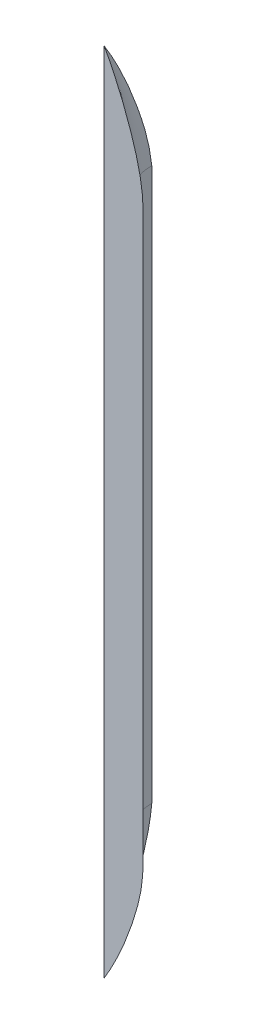
ISO-10303-21;
HEADER;
FILE_DESCRIPTION(('STEP AP214'),'2;1');
FILE_NAME('part.step','',(''),(''),'','','');
FILE_SCHEMA(('AUTOMOTIVE_DESIGN { 1 0 10303 214 1 1 1 1 }'));
ENDSEC;
DATA;
#1=APPLICATION_CONTEXT('core data for automotive mechanical design processes');
#2=APPLICATION_PROTOCOL_DEFINITION('international standard','automotive_design',2000,#1);
#3=PRODUCT_CONTEXT('',#1,'mechanical');
#4=PRODUCT('Part','Part','',(#3));
#5=PRODUCT_RELATED_PRODUCT_CATEGORY('part','',(#4));
#6=PRODUCT_DEFINITION_FORMATION('','',#4);
#7=PRODUCT_DEFINITION_CONTEXT('part definition',#1,'design');
#8=PRODUCT_DEFINITION('design','',#6,#7);
#9=PRODUCT_DEFINITION_SHAPE('','',#8);
#10=(LENGTH_UNIT() NAMED_UNIT(*) SI_UNIT(.MILLI.,.METRE.));
#11=(NAMED_UNIT(*) PLANE_ANGLE_UNIT() SI_UNIT($,.RADIAN.));
#12=(NAMED_UNIT(*) SI_UNIT($,.STERADIAN.) SOLID_ANGLE_UNIT());
#13=UNCERTAINTY_MEASURE_WITH_UNIT(LENGTH_MEASURE(1.E-05),#10,'distance_accuracy_value','');
#14=(GEOMETRIC_REPRESENTATION_CONTEXT(3) GLOBAL_UNCERTAINTY_ASSIGNED_CONTEXT((#13)) GLOBAL_UNIT_ASSIGNED_CONTEXT((#10,
#11,#12)) REPRESENTATION_CONTEXT('',''));
#15=CARTESIAN_POINT('',(0.,0.,0.));
#16=DIRECTION('',(0.,0.,1.));
#17=DIRECTION('',(1.,0.,0.));
#18=AXIS2_PLACEMENT_3D('',#15,#16,#17);
#19=CARTESIAN_POINT('',(-5.0632934730048,495.3,-82.4443347354502));
#20=DIRECTION('',(0.0640045787989284,0.,-0.997949604886325));
#21=DIRECTION('',(-0.997949604886325,0.,-0.0640045787989284));
#22=AXIS2_PLACEMENT_3D('',#19,#20,#21);
#23=PLANE('',#22);
#24=DIRECTION('',(0.,-1.,0.));
#25=VECTOR('',#24,1.);
#26=CARTESIAN_POINT('',(-5.0632934730048,495.3,-82.4443347354502));
#27=LINE('',#26,#25);
#28=CARTESIAN_POINT('',(-5.0632934730048,448.126304510423,-82.4443347354502));
#29=VERTEX_POINT('',#28);
#30=CARTESIAN_POINT('',(-5.0632934730048,47.1736954896169,-82.4443347354502));
#31=VERTEX_POINT('',#30);
#32=EDGE_CURVE('E100',#29,#31,#27,.T.);
#33=ORIENTED_EDGE('',*,*,#32,.T.);
#34=CARTESIAN_POINT('',(15.5577269047475,110.49,-81.1217832586825));
#35=CARTESIAN_POINT('',(15.5575366935233,109.786608337865,-81.1218317490463));
#36=CARTESIAN_POINT('',(15.5550280221709,109.083189292789,-81.1223021604709));
#37=CARTESIAN_POINT('',(15.5431777345897,107.744037800418,-81.1236801610753));
#38=CARTESIAN_POINT('',(15.5345161344242,107.108298758008,-81.1245413785588));
#39=CARTESIAN_POINT('',(15.5104082642399,105.904392980931,-81.1263288035558));
#40=CARTESIAN_POINT('',(15.4957790268235,105.336210924997,-81.1272384300958));
#41=CARTESIAN_POINT('',(15.459493830325,104.267470258499,-81.1292084447515));
#42=CARTESIAN_POINT('',(15.4388762864435,103.766878876906,-81.130238183201));
#43=CARTESIAN_POINT('',(15.4012597654857,103.041619563127,-81.1322135831098));
#44=CARTESIAN_POINT('',(15.3885149868308,102.816732244992,-81.132893572759));
#45=CARTESIAN_POINT('',(15.3612022898933,102.383930340124,-81.1344597593817));
#46=CARTESIAN_POINT('',(15.3468416673897,102.176002738283,-81.1353267590709));
#47=CARTESIAN_POINT('',(15.3107073608198,101.69526548088,-81.1376022954161));
#48=CARTESIAN_POINT('',(15.2880204485959,101.422524999556,-81.1390953939153));
#49=CARTESIAN_POINT('',(15.2389411429204,100.875242351012,-81.1423169858888));
#50=CARTESIAN_POINT('',(15.2125212737476,100.600702690005,-81.1440472216447));
#51=CARTESIAN_POINT('',(15.1270625482394,99.7710618712145,-81.1496430884118));
#52=CARTESIAN_POINT('',(15.0623249569574,99.2165396990564,-81.1538810891806));
#53=CARTESIAN_POINT('',(14.9173825192057,98.1002297950573,-81.1632627509594));
#54=CARTESIAN_POINT('',(14.8369399369539,97.538473275101,-81.1684202102351));
#55=CARTESIAN_POINT('',(14.6603607459544,96.4076607703985,-81.1796685657268));
#56=CARTESIAN_POINT('',(14.5639806328903,95.8386430002989,-81.1857738371608));
#57=CARTESIAN_POINT('',(14.355508967988,94.6932696782545,-81.1989641176007));
#58=CARTESIAN_POINT('',(14.2431731278992,94.1169588147895,-81.2060643311504));
#59=CARTESIAN_POINT('',(13.9393630117844,92.6558602000597,-81.2256238920259));
#60=CARTESIAN_POINT('',(13.7379910453242,91.7731411294594,-81.2389023704842));
#61=CARTESIAN_POINT('',(13.2840344775509,89.9099546166205,-81.2688667712425));
#62=CARTESIAN_POINT('',(13.0282091230779,88.9302920804297,-81.2857699988611));
#63=CARTESIAN_POINT('',(12.4624571625742,86.8732748422379,-81.3226919713213));
#64=CARTESIAN_POINT('',(12.1496708589326,85.7967133794336,-81.3428504154451));
#65=CARTESIAN_POINT('',(11.4657847371205,83.5466552756897,-81.386410307294));
#66=CARTESIAN_POINT('',(11.0919738875445,82.3739864787359,-81.4099360408043));
#67=CARTESIAN_POINT('',(10.4966927279046,80.5828660558859,-81.4472867205596));
#68=CARTESIAN_POINT('',(10.2854693539199,79.9609726575605,-81.4605195909538));
#69=CARTESIAN_POINT('',(9.84556336889945,78.693892610274,-81.4883501613545));
#70=CARTESIAN_POINT('',(9.61652014958023,78.0488317558467,-81.5029819023576));
#71=CARTESIAN_POINT('',(9.19028844175516,76.8700360711208,-81.530038711265));
#72=CARTESIAN_POINT('',(8.99424666011761,76.3358836900514,-81.5424195038367));
#73=CARTESIAN_POINT('',(8.59882910881611,75.2713117913826,-81.5668338746006));
#74=CARTESIAN_POINT('',(8.39947039926122,74.740885960814,-81.5788686729805));
#75=CARTESIAN_POINT('',(7.79690089351121,73.1590836033903,-81.6148520894418));
#76=CARTESIAN_POINT('',(7.38673054130219,72.1103457202904,-81.6388336360614));
#77=CARTESIAN_POINT('',(6.54949127412712,70.0304709509396,-81.6881876652177));
#78=CARTESIAN_POINT('',(6.12260488205441,68.9992604705393,-81.7135458961838));
#79=CARTESIAN_POINT('',(5.46689962938753,67.4632707725281,-81.7541079586448));
#80=CARTESIAN_POINT('',(5.24656112429327,66.9548279263916,-81.7679968086626));
#81=CARTESIAN_POINT('',(4.80113811555572,65.9429049599631,-81.7968306849424));
#82=CARTESIAN_POINT('',(4.57608077710105,65.4394127465857,-81.8117704418132));
#83=CARTESIAN_POINT('',(4.12104045000123,64.4375886843729,-81.8430009154255));
#84=CARTESIAN_POINT('',(3.89108598268971,63.939243681381,-81.8592848681738));
#85=CARTESIAN_POINT('',(3.54202040842532,63.1947993683425,-81.8849030657872));
#86=CARTESIAN_POINT('',(3.4251910087108,62.9476072820322,-81.893624351331));
#87=CARTESIAN_POINT('',(3.19015134828709,62.4546323668223,-81.9116062668161));
#88=CARTESIAN_POINT('',(3.07194509718709,62.2088475769732,-81.9208655453332));
#89=CARTESIAN_POINT('',(2.84460824645599,61.7389759752497,-81.9387128065561));
#90=CARTESIAN_POINT('',(2.73557238881176,61.5148427800191,-81.9472899576738));
#91=CARTESIAN_POINT('',(2.51550951584694,61.0638215499608,-81.9642554084271));
#92=CARTESIAN_POINT('',(2.40447539320521,60.836936830662,-81.9726396392685));
#93=CARTESIAN_POINT('',(2.06589884687473,60.1478350553994,-81.9978408406551));
#94=CARTESIAN_POINT('',(1.83722883753943,59.6861603638199,-82.0143636836794));
#95=CARTESIAN_POINT('',(1.37068282969449,58.75255996733,-82.0471162350432));
#96=CARTESIAN_POINT('',(1.13272137403132,58.2806762840697,-82.0633274508181));
#97=CARTESIAN_POINT('',(0.646931514773846,57.327113002047,-82.0956010434976));
#98=CARTESIAN_POINT('',(0.399005084827022,56.8454828972528,-82.1116496046755));
#99=CARTESIAN_POINT('',(-0.369626198345435,55.3692328513354,-82.1603744495625));
#100=CARTESIAN_POINT('',(-0.897713209060645,54.3784168512676,-82.1924244355208));
#101=CARTESIAN_POINT('',(-2.00128167439423,52.3635875478879,-82.258328274264));
#102=CARTESIAN_POINT('',(-2.577825604154,51.3401544501378,-82.2921970750983));
#103=CARTESIAN_POINT('',(-3.78428318262059,49.2651146064168,-82.364387936577));
#104=CARTESIAN_POINT('',(-4.41542797012666,48.214229115757,-82.4028398770589));
#105=CARTESIAN_POINT('',(-5.0632934730048,47.1736954896169,-82.4443347354502));
#106=B_SPLINE_CURVE_WITH_KNOTS('',3,(#34,#35,#36,#37,#38,#39,#40,#41,#42,#43,#44,#45,#46,#47,
#48,#49,#50,#51,#52,#53,#54,#55,#56,#57,#58,#59,#60,#61,#62,#63,#64,#65,#66,#67,#68,#69,#70,#71,
#72,#73,#74,#75,#76,#77,#78,#79,#80,#81,#82,#83,#84,#85,#86,#87,#88,#89,#90,#91,#92,#93,#94,#95,
#96,#97,#98,#99,#100,#101,#102,#103,#104,#105),.UNSPECIFIED.,.F.,.F.,(4,2,2,2,2,2,2,2,2,2,2,2,2,
2,2,2,2,2,2,2,2,2,2,2,2,2,2,2,2,2,2,2,2,2,2,4),(0.,2.11021294848877,4.01757617488843,
5.72264034907928,7.2256022195464,7.9013358028512,8.52659385749051,9.34762277126733,
10.1750442567903,11.8497402288947,13.5520876399653,15.2833688844945,17.0447869286252,
19.7606917128943,22.7982538785374,26.1616511554232,29.8543129571136,31.8250205335883,
33.8789780952208,35.5863380402268,37.2866649087354,40.6655135515084,44.014341264787,
45.6772303172088,47.3323058113954,48.9795087714192,49.8001504287814,50.6188129985741,
51.3669983162158,52.1252058701779,53.671594938095,55.2577882064351,56.8835746718496,
60.2529780543273,63.7779949493876,67.4569401812508),.UNSPECIFIED.);
#107=CARTESIAN_POINT('',(15.5538463388611,110.49,-81.1222774657432));
#108=VERTEX_POINT('',#107);
#109=EDGE_CURVE('E12',#31,#108,#106,.F.);
#110=ORIENTED_EDGE('',*,*,#109,.T.);
#111=DIRECTION('',(0.,-1.,0.));
#112=VECTOR('',#111,1.);
#113=CARTESIAN_POINT('',(15.553799764757,495.3,-81.1220351300593));
#114=LINE('',#113,#112);
#115=CARTESIAN_POINT('',(15.5557633347523,384.81,-81.1219091943709));
#116=VERTEX_POINT('',#115);
#117=EDGE_CURVE('E103',#116,#108,#114,.T.);
#118=ORIENTED_EDGE('',*,*,#117,.F.);
#119=CARTESIAN_POINT('',(-5.06329347300487,448.126304510423,-82.4443347354503));
#120=CARTESIAN_POINT('',(-4.54310536157747,447.290836051475,-82.4108329491727));
#121=CARTESIAN_POINT('',(-4.03234753509438,446.449497365503,-82.3776543123072));
#122=CARTESIAN_POINT('',(-2.99342851650294,444.695093743187,-82.3100855320759));
#123=CARTESIAN_POINT('',(-2.46664382864215,443.781210016785,-82.2757790009647));
#124=CARTESIAN_POINT('',(-1.39949043381827,441.880225064239,-82.2068217596031));
#125=CARTESIAN_POINT('',(-0.8605641195627,440.89231015954,-82.1723010798713));
#126=CARTESIAN_POINT('',(0.227478989577566,438.842308407112,-82.1030328292366));
#127=CARTESIAN_POINT('',(0.775132330113729,437.779440700385,-82.0684055792594));
#128=CARTESIAN_POINT('',(1.59020391293753,436.152591437293,-82.0168940334973));
#129=CARTESIAN_POINT('',(1.8664318039864,435.593017566567,-81.9994411800814));
#130=CARTESIAN_POINT('',(2.42035444091683,434.455218972556,-81.9642078845472));
#131=CARTESIAN_POINT('',(2.69787526181041,433.876909316685,-81.9464318803808));
#132=CARTESIAN_POINT('',(3.20385404486276,432.806217800267,-81.9142238789823));
#133=CARTESIAN_POINT('',(3.43329238379445,432.314302093572,-81.899698107054));
#134=CARTESIAN_POINT('',(3.87532104592261,431.353069427417,-81.8721558443334));
#135=CARTESIAN_POINT('',(4.08817495129466,430.883874752685,-81.8591001668305));
#136=CARTESIAN_POINT('',(4.68617730705948,429.548921878612,-81.8226368946435));
#137=CARTESIAN_POINT('',(5.06602472559113,428.680773214917,-81.7997356959407));
#138=CARTESIAN_POINT('',(6.05421966718013,426.372478044547,-81.7398469334692));
#139=CARTESIAN_POINT('',(6.65065860250828,424.927216913056,-81.7033759216996));
#140=CARTESIAN_POINT('',(7.64792886805931,422.434752328516,-81.6394917962511));
#141=CARTESIAN_POINT('',(8.05637697302166,421.390565175931,-81.6124339374562));
#142=CARTESIAN_POINT('',(8.59921901271706,419.974758204318,-81.5748420683154));
#143=CARTESIAN_POINT('',(8.73979877063413,419.605485906506,-81.5649544831246));
#144=CARTESIAN_POINT('',(8.98045818591475,418.969336502394,-81.5477098179637));
#145=CARTESIAN_POINT('',(9.08090818955125,418.70259826831,-81.5404153089989));
#146=CARTESIAN_POINT('',(9.24213950199601,418.271689839071,-81.5286692505397));
#147=CARTESIAN_POINT('',(9.30327375002304,418.107650923481,-81.5242066213181));
#148=CARTESIAN_POINT('',(9.3872493358516,417.882558744905,-81.5179114642086));
#149=CARTESIAN_POINT('',(9.41004236475164,417.821487034178,-81.5161861314594));
#150=CARTESIAN_POINT('',(9.46250405229587,417.678205157731,-81.5125535202861));
#151=CARTESIAN_POINT('',(9.49187003053749,417.595880862759,-81.5107844629964));
#152=CARTESIAN_POINT('',(9.55063446999732,417.431713104916,-81.5071099904551));
#153=CARTESIAN_POINT('',(9.58003203847406,417.349869291985,-81.5052052994124));
#154=CARTESIAN_POINT('',(9.66748570623671,417.105459818169,-81.4995837012212));
#155=CARTESIAN_POINT('',(9.72524921671702,416.942787259255,-81.4959296728174));
#156=CARTESIAN_POINT('',(9.83970246635365,416.618911006539,-81.4886780233115));
#157=CARTESIAN_POINT('',(9.89639715876105,416.457709059347,-81.4850802051276));
#158=CARTESIAN_POINT('',(10.0086496915035,416.136750815702,-81.4779753281481));
#159=CARTESIAN_POINT('',(10.0642132294125,415.976996525957,-81.4744677181043));
#160=CARTESIAN_POINT('',(10.2283964287872,415.502387204995,-81.4641143371477));
#161=CARTESIAN_POINT('',(10.3362476886985,415.187264636529,-81.4573278907551));
#162=CARTESIAN_POINT('',(10.5476121057884,414.562885679937,-81.4440438726744));
#163=CARTESIAN_POINT('',(10.6511688245411,414.253644085804,-81.4375432280802));
#164=CARTESIAN_POINT('',(10.9522281190891,413.344644997367,-81.4186414688683));
#165=CARTESIAN_POINT('',(11.1469179411347,412.743948967681,-81.406413986046));
#166=CARTESIAN_POINT('',(11.5199468032046,411.566370503538,-81.3828939585697));
#167=CARTESIAN_POINT('',(11.6986285196,410.989596904191,-81.3715839188197));
#168=CARTESIAN_POINT('',(12.0402749012769,409.860039246955,-81.3498287192234));
#169=CARTESIAN_POINT('',(12.2035847304427,409.307360090661,-81.3393676356166));
#170=CARTESIAN_POINT('',(12.514983402368,408.226112576805,-81.31929244037));
#171=CARTESIAN_POINT('',(12.6634267689103,407.697646443691,-81.3096617029959));
#172=CARTESIAN_POINT('',(13.0759742667982,406.187777956141,-81.2827284018913));
#173=CARTESIAN_POINT('',(13.3309419259207,405.203841247798,-81.2658755831084));
#174=CARTESIAN_POINT('',(13.7827037452345,403.332347019899,-81.2360413036023));
#175=CARTESIAN_POINT('',(13.9827984306741,402.445600748034,-81.2228389131066));
#176=CARTESIAN_POINT('',(14.2814310180771,400.989879421581,-81.2036107238651));
#177=CARTESIAN_POINT('',(14.390379963242,400.423051448544,-81.1967243337352));
#178=CARTESIAN_POINT('',(14.5926131733855,399.295922689228,-81.1839276015934));
#179=CARTESIAN_POINT('',(14.6861195137932,398.735661940543,-81.1780034472109));
#180=CARTESIAN_POINT('',(14.8574729110574,397.621641313427,-81.1670872304891));
#181=CARTESIAN_POINT('',(14.935540517862,397.067915526536,-81.1620821266432));
#182=CARTESIAN_POINT('',(15.0762444767443,395.966946173725,-81.152975796507));
#183=CARTESIAN_POINT('',(15.1390951657154,395.419730298778,-81.1488621132523));
#184=CARTESIAN_POINT('',(15.222069850707,394.600802947482,-81.1434300907328));
#185=CARTESIAN_POINT('',(15.2477326377544,394.329644866745,-81.1417498297351));
#186=CARTESIAN_POINT('',(15.2954161719238,393.788945026402,-81.1386204520046));
#187=CARTESIAN_POINT('',(15.3174615010941,393.519405471745,-81.1371697777601));
#188=CARTESIAN_POINT('',(15.3525904675982,393.044068051393,-81.134957567614));
#189=CARTESIAN_POINT('',(15.366558992799,392.838336084352,-81.1341141884493));
#190=CARTESIAN_POINT('',(15.3931269042465,392.410046466421,-81.132590557464));
#191=CARTESIAN_POINT('',(15.4055236183647,392.187476307884,-81.1319290626336));
#192=CARTESIAN_POINT('',(15.4421188216672,391.46952241171,-81.1300070669722));
#193=CARTESIAN_POINT('',(15.4621721950059,390.973928624369,-81.1290054103763));
#194=CARTESIAN_POINT('',(15.4974686562344,389.915660957445,-81.1270890841452));
#195=CARTESIAN_POINT('',(15.5116980790659,389.352955660283,-81.1262043711283));
#196=CARTESIAN_POINT('',(15.5351495973464,388.16048117063,-81.1244658667778));
#197=CARTESIAN_POINT('',(15.5435746373777,387.530697300869,-81.1236282743575));
#198=CARTESIAN_POINT('',(15.5551018575363,386.203937753333,-81.1222879480564));
#199=CARTESIAN_POINT('',(15.5575409095161,385.506955759654,-81.1218304261684));
#200=CARTESIAN_POINT('',(15.5577269047476,384.81,-81.1217832586825));
#201=B_SPLINE_CURVE_WITH_KNOTS('',3,(#119,#120,#121,#122,#123,#124,#125,#126,#127,#128,#129,
#130,#131,#132,#133,#134,#135,#136,#137,#138,#139,#140,#141,#142,#143,#144,#145,#146,#147,#148,
#149,#150,#151,#152,#153,#154,#155,#156,#157,#158,#159,#160,#161,#162,#163,#164,#165,#166,#167,
#168,#169,#170,#171,#172,#173,#174,#175,#176,#177,#178,#179,#180,#181,#182,#183,#184,#185,#186,
#187,#188,#189,#190,#191,#192,#193,#194,#195,#196,#197,#198,#199,#200),.UNSPECIFIED.,.F.,.F.,(4,
2,2,2,2,2,2,2,2,2,2,2,2,2,2,2,2,2,2,2,2,2,2,2,2,2,2,2,2,2,2,2,2,2,2,2,2,2,2,2,4),(0.,
2.95416187233922,6.12006178436045,9.49739728527208,13.0855312214746,14.9583498434215,
16.8833974974611,18.5123255677352,20.0584539227639,22.9019831580546,27.5932501997105,
30.9578153006119,32.1435627537203,32.9989149699725,33.5242700414307,33.7198948585671,
33.9821571306371,34.2431111686994,34.7610958869914,35.2738524051772,35.7813841271353,
36.780786455779,37.7593357342152,39.6540073726629,41.4657271800879,43.1948639354291,
44.8418359492832,47.89111355343,50.617932201641,52.3494884903031,54.0534348848416,
55.7309305845744,57.3832083087989,58.2003152140259,59.0116163656147,59.6302229661359,
60.2989578827346,61.7868740282755,63.4754847394008,65.3649758676464,67.4558795399028),.UNSPECIFIED.);
#202=EDGE_CURVE('E98',#116,#29,#201,.F.);
#203=ORIENTED_EDGE('',*,*,#202,.T.);
#204=EDGE_LOOP('',(#33,#110,#118,#203));
#205=FACE_BOUND('',#204,.T.);
#206=ADVANCED_FACE('F52',(#205),#23,.F.);
#207=CARTESIAN_POINT('',(20.3367065269952,495.3,-106.067652037719));
#208=DIRECTION('',(0.,-1.,0.));
#209=DIRECTION('',(0.,0.,-1.));
#210=AXIS2_PLACEMENT_3D('',#207,#208,#209);
#211=CYLINDRICAL_SURFACE('',#210,25.4);
#212=ORIENTED_EDGE('',*,*,#117,.T.);
#213=CARTESIAN_POINT('',(-5.00273344640759,110.49,-107.820587243116));
#214=CARTESIAN_POINT('',(-5.22469859656491,110.49,-104.611984562717));
#215=CARTESIAN_POINT('',(-4.4349317286756,110.49,-98.1107481066585));
#216=CARTESIAN_POINT('',(0.281451387874984,110.49,-89.4923527921373));
#217=CARTESIAN_POINT('',(7.85756033175236,110.49,-83.2374682391791));
#218=CARTESIAN_POINT('',(14.0937797318742,110.49,-81.237624556466));
#219=CARTESIAN_POINT('',(17.2867802001309,110.49,-80.8514281054828));
#220=B_SPLINE_CURVE_WITH_KNOTS('',3,(#213,#214,#215,#216,#217,#218,#219),.UNSPECIFIED.,.F.,.F.,
(4,1,1,1,4),(4.64332088265171,5.02319542018311,5.40306995771452,5.78294449524592,
6.16281903277733),.UNSPECIFIED.);
#221=CARTESIAN_POINT('',(-5.06329347300481,110.49,-106.067652037719));
#222=VERTEX_POINT('',#221);
#223=EDGE_CURVE('E110',#108,#222,#220,.F.);
#224=ORIENTED_EDGE('',*,*,#223,.T.);
#225=DIRECTION('',(0.,-1.,0.));
#226=VECTOR('',#225,1.);
#227=CARTESIAN_POINT('',(-5.06329347300481,495.3,-106.067652037719));
#228=LINE('',#227,#226);
#229=CARTESIAN_POINT('',(-5.06304670242382,384.81,-106.067652146018));
#230=VERTEX_POINT('',#229);
#231=EDGE_CURVE('E119',#230,#222,#228,.T.);
#232=ORIENTED_EDGE('',*,*,#231,.F.);
#233=CARTESIAN_POINT('',(17.2867802001309,384.81,-80.8514281054828));
#234=CARTESIAN_POINT('',(14.0937797318742,384.81,-81.237624556466));
#235=CARTESIAN_POINT('',(7.85756033175236,384.81,-83.2374682391791));
#236=CARTESIAN_POINT('',(0.281451387874984,384.81,-89.4923527921373));
#237=CARTESIAN_POINT('',(-4.4349317286756,384.81,-98.1107481066586));
#238=CARTESIAN_POINT('',(-5.22469859656491,384.81,-104.611984562717));
#239=CARTESIAN_POINT('',(-5.00273344640759,384.81,-107.820587243116));
#240=B_SPLINE_CURVE_WITH_KNOTS('',3,(#233,#234,#235,#236,#237,#238,#239),.UNSPECIFIED.,.F.,.F.,
(4,1,1,1,4),(4.6433208826517,5.02319542018311,5.40306995771452,5.78294449524592,
6.16281903277733),.UNSPECIFIED.);
#241=EDGE_CURVE('E111',#230,#116,#240,.F.);
#242=ORIENTED_EDGE('',*,*,#241,.T.);
#243=EDGE_LOOP('',(#212,#224,#232,#242));
#244=FACE_BOUND('',#243,.T.);
#245=ADVANCED_FACE('F213',(#244),#211,.F.);
#246=CARTESIAN_POINT('',(-5.0632934730048,495.3,-82.4443347354502));
#247=DIRECTION('',(1.,0.,0.));
#248=DIRECTION('',(0.,0.,-1.));
#249=AXIS2_PLACEMENT_3D('',#246,#247,#248);
#250=PLANE('',#249);
#251=ORIENTED_EDGE('',*,*,#231,.T.);
#252=CARTESIAN_POINT('',(-5.0632934730048,81.661043667116,-98.850949476124));
#253=CARTESIAN_POINT('',(-5.06328481235157,82.3590345839259,-99.1032785890547));
#254=CARTESIAN_POINT('',(-5.06324965725077,83.0583522619946,-99.3519234050984));
#255=CARTESIAN_POINT('',(-5.06318741172048,84.4265520092989,-99.8302081109327));
#256=CARTESIAN_POINT('',(-5.06316001914847,85.0953140943441,-100.060191270775));
#257=CARTESIAN_POINT('',(-5.06316385310967,87.0061431657457,-100.706415238622));
#258=CARTESIAN_POINT('',(-5.06326493975883,88.2510353134657,-101.114338848398));
#259=CARTESIAN_POINT('',(-5.06350979025156,90.6174512920908,-101.862399008373));
#260=CARTESIAN_POINT('',(-5.06364793158637,91.7381455147763,-102.205148243285));
#261=CARTESIAN_POINT('',(-5.06361599024677,93.3757873014082,-102.684938071475));
#262=CARTESIAN_POINT('',(-5.06357266459689,93.8896589042439,-102.832490250778));
#263=CARTESIAN_POINT('',(-5.06340414326251,94.8865128992017,-103.112123086913));
#264=CARTESIAN_POINT('',(-5.06328431712565,95.3693862304786,-103.244591363688));
#265=CARTESIAN_POINT('',(-5.06281531831477,96.458048413108,-103.534452457923));
#266=CARTESIAN_POINT('',(-5.06241629774852,97.0643862874075,-103.689797047802));
#267=CARTESIAN_POINT('',(-5.06153584863362,98.2780050442409,-103.98774193691));
#268=CARTESIAN_POINT('',(-5.0610547026811,98.8852758420464,-104.130383468214));
#269=CARTESIAN_POINT('',(-5.05983475199395,100.70606986791,-104.539236293396));
#270=CARTESIAN_POINT('',(-5.05931356838022,101.923625263527,-104.787719818228));
#271=CARTESIAN_POINT('',(-5.05949747951277,104.362908582053,-105.235979939832));
#272=CARTESIAN_POINT('',(-5.06019797618004,105.584603661363,-105.435935956329));
#273=CARTESIAN_POINT('',(-5.06170049140824,108.033364423124,-105.787784827677));
#274=CARTESIAN_POINT('',(-5.06250238432221,109.260421674521,-105.939736366505));
#275=CARTESIAN_POINT('',(-5.06279993193789,110.49,-106.067652470908));
#276=B_SPLINE_CURVE_WITH_KNOTS('',3,(#252,#253,#254,#255,#256,#257,#258,#259,#260,#261,#262,
#263,#264,#265,#266,#267,#268,#269,#270,#271,#272,#273,#274,#275),.UNSPECIFIED.,.F.,.F.,(4,2,2,
2,2,2,2,2,2,2,2,4),(0.,2.2265804516336,4.34815542483877,8.27796223360794,11.793484820674,
13.3973608335437,14.8994623017324,16.7770926078471,18.6483875866108,22.375309491811,
26.0882345109761,29.7966028721281),.UNSPECIFIED.);
#277=CARTESIAN_POINT('',(-5.06329347300481,81.661043667116,-98.850949476124));
#278=VERTEX_POINT('',#277);
#279=EDGE_CURVE('E67',#222,#278,#276,.F.);
#280=ORIENTED_EDGE('',*,*,#279,.T.);
#281=CARTESIAN_POINT('',(-5.06329347300479,47.1736954896169,-82.4443347354502));
#282=CARTESIAN_POINT('',(-5.06331840473781,47.7577799043694,-82.8116530849268));
#283=CARTESIAN_POINT('',(-5.06360504181937,48.3446473419906,-83.1745154928133));
#284=CARTESIAN_POINT('',(-5.06439137439873,49.5500519020011,-83.9074334496417));
#285=CARTESIAN_POINT('',(-5.06490000868985,50.1688333953745,-84.2770871406655));
#286=CARTESIAN_POINT('',(-5.06624137428371,52.1130852148333,-85.41848489263));
#287=CARTESIAN_POINT('',(-5.06679258998858,53.448440768133,-86.173487986878));
#288=CARTESIAN_POINT('',(-5.06671978872928,55.5084492265142,-87.2972982781767));
#289=CARTESIAN_POINT('',(-5.06652638159156,56.2251385804485,-87.6808304598219));
#290=CARTESIAN_POINT('',(-5.06593481172481,57.6912850980401,-88.4510545678187));
#291=CARTESIAN_POINT('',(-5.06552924533097,58.4409635068258,-88.8373260045675));
#292=CARTESIAN_POINT('',(-5.06468453385262,59.9730411011339,-89.6122939330384));
#293=CARTESIAN_POINT('',(-5.06424470587988,60.7556482411944,-90.000579020538));
#294=CARTESIAN_POINT('',(-5.06370799298791,61.9438666400471,-90.5794042978021));
#295=CARTESIAN_POINT('',(-5.06354841422304,62.3474383207218,-90.7741446927195));
#296=CARTESIAN_POINT('',(-5.06337231804415,63.1626718637164,-91.1640658265244));
#297=CARTESIAN_POINT('',(-5.06335823559209,63.5743562315403,-91.3591995535411));
#298=CARTESIAN_POINT('',(-5.06323659449971,64.3490058531598,-91.7227329072105));
#299=CARTESIAN_POINT('',(-5.06314062418898,64.7118008428181,-91.8914951758934));
#300=CARTESIAN_POINT('',(-5.06269514116411,65.4385124913961,-92.2262580539967));
#301=CARTESIAN_POINT('',(-5.06234571469447,65.8024287268528,-92.3922595831748));
#302=CARTESIAN_POINT('',(-5.06111057186478,66.8954504617134,-92.8862955987582));
#303=CARTESIAN_POINT('',(-5.06003779872175,67.6262609301195,-93.2105639693053));
#304=CARTESIAN_POINT('',(-5.05781510707704,69.0912490903065,-93.8494997454453));
#305=CARTESIAN_POINT('',(-5.05666526135751,69.8254230119731,-94.1641758118821));
#306=CARTESIAN_POINT('',(-5.05465242590855,71.296504462486,-94.7847487411148));
#307=CARTESIAN_POINT('',(-5.05378911757986,72.0334080277824,-95.0906550067471));
#308=CARTESIAN_POINT('',(-5.0520989973264,74.2457056132376,-95.9957767422154));
#309=CARTESIAN_POINT('',(-5.05216472017408,75.7257120692602,-96.583705896522));
#310=CARTESIAN_POINT('',(-5.05531765975024,78.689861385565,-97.7341432343376));
#311=CARTESIAN_POINT('',(-5.05839471049539,80.1739735781392,-98.2967302873297));
#312=CARTESIAN_POINT('',(-5.0632934730048,81.661043667116,-98.850949476124));
#313=B_SPLINE_CURVE_WITH_KNOTS('',3,(#281,#282,#283,#284,#285,#286,#287,#288,#289,#290,#291,
#292,#293,#294,#295,#296,#297,#298,#299,#300,#301,#302,#303,#304,#305,#306,#307,#308,#309,#310,
#311,#312),.UNSPECIFIED.,.F.,.F.,(4,2,2,2,2,2,2,2,2,2,2,2,2,2,2,4),(0.,2.06990017864016,
4.23219027625693,8.8333305955536,11.2718367823427,13.8017524591609,16.422555379986,
17.766847581487,19.1336015336528,20.3339692905105,21.5339287851305,23.9324168027834,
26.3286709193867,28.722251658871,33.4995235211212,38.2607231640439),.UNSPECIFIED.);
#314=EDGE_CURVE('E78',#278,#31,#313,.F.);
#315=ORIENTED_EDGE('',*,*,#314,.T.);
#316=ORIENTED_EDGE('',*,*,#32,.F.);
#317=CARTESIAN_POINT('',(-5.0632934730048,413.664662679792,-98.8416536651432));
#318=CARTESIAN_POINT('',(-5.06302041303787,415.183678067427,-98.2921604151542));
#319=CARTESIAN_POINT('',(-5.06468238645625,416.698412555973,-97.7302188072792));
#320=CARTESIAN_POINT('',(-5.06932385676634,419.702327942396,-96.5796455365657));
#321=CARTESIAN_POINT('',(-5.07229157223176,421.19161635993,-95.9912938533326));
#322=CARTESIAN_POINT('',(-5.0758715742867,423.408626975844,-95.0824503932688));
#323=CARTESIAN_POINT('',(-5.07691743581947,424.142208451092,-94.7762615448032));
#324=CARTESIAN_POINT('',(-5.07816278160677,425.601409741811,-94.1552663087752));
#325=CARTESIAN_POINT('',(-5.07836645264705,426.327051011478,-93.8405103989683));
#326=CARTESIAN_POINT('',(-5.07730354690726,427.769807737956,-93.201735196978));
#327=CARTESIAN_POINT('',(-5.07604449764127,428.486947828537,-92.8777716285458));
#328=CARTESIAN_POINT('',(-5.07263567176868,429.557332820924,-92.383985675602));
#329=CARTESIAN_POINT('',(-5.07125023319021,429.912546230056,-92.2184171828357));
#330=CARTESIAN_POINT('',(-5.06769602865695,430.620541087165,-91.8845647970752));
#331=CARTESIAN_POINT('',(-5.06552934720985,430.973326484631,-91.7162892578748));
#332=CARTESIAN_POINT('',(-5.0611919162934,431.656693819706,-91.3877550790004));
#333=CARTESIAN_POINT('',(-5.05902923046274,431.987336449599,-91.227622116998));
#334=CARTESIAN_POINT('',(-5.05524813517817,432.651929409201,-90.9044692908783));
#335=CARTESIAN_POINT('',(-5.05363628638813,432.985873937846,-90.7414374258123));
#336=CARTESIAN_POINT('',(-5.04933013284749,433.997974330685,-90.2446218626878));
#337=CARTESIAN_POINT('',(-5.04723975522673,434.675026111455,-89.9085775661076));
#338=CARTESIAN_POINT('',(-5.04454158645244,436.040596095786,-89.2221889173107));
#339=CARTESIAN_POINT('',(-5.04396749264844,436.7290380668,-88.8716926311497));
#340=CARTESIAN_POINT('',(-5.04404225929115,438.11629475384,-88.1549067020547));
#341=CARTESIAN_POINT('',(-5.04471743740465,438.815017944238,-87.7884396715734));
#342=CARTESIAN_POINT('',(-5.04695913228144,440.22166824633,-87.0382206936211));
#343=CARTESIAN_POINT('',(-5.04854372135391,440.929488510953,-86.6542681977722));
#344=CARTESIAN_POINT('',(-5.05212467844586,442.353046488523,-85.8675117664937));
#345=CARTESIAN_POINT('',(-5.05412862153854,443.068660978933,-85.4644846528457));
#346=CARTESIAN_POINT('',(-5.0579344563098,444.506422017847,-84.6379561896267));
#347=CARTESIAN_POINT('',(-5.05973170057705,445.228427972384,-84.2142097867662));
#348=CARTESIAN_POINT('',(-5.06241294510746,446.677462623761,-83.3445471225705));
#349=CARTESIAN_POINT('',(-5.06327916446728,447.404331087617,-82.8983639852461));
#350=CARTESIAN_POINT('',(-5.06329347300482,448.126304510423,-82.4443347354502));
#351=B_SPLINE_CURVE_WITH_KNOTS('',3,(#317,#318,#319,#320,#321,#322,#323,#324,#325,#326,#327,
#328,#329,#330,#331,#332,#333,#334,#335,#336,#337,#338,#339,#340,#341,#342,#343,#344,#345,#346,
#347,#348,#349,#350),.UNSPECIFIED.,.F.,.F.,(4,2,2,2,2,2,2,2,2,2,2,2,2,2,2,2,4),(0.,
4.8463253898546,9.64979255774889,12.0344767885753,14.4072916684275,16.7679493572249,
17.9436582778041,19.1162531148754,20.2184057064899,21.3332617541384,23.6008139624222,
25.9183512559305,28.2852674781661,30.7009346411859,33.1647302895117,35.6760892765279,
38.2346021460237),.UNSPECIFIED.);
#352=CARTESIAN_POINT('',(-5.06329347300481,413.664662679792,-98.8416536651432));
#353=VERTEX_POINT('',#352);
#354=EDGE_CURVE('E115',#29,#353,#351,.F.);
#355=ORIENTED_EDGE('',*,*,#354,.T.);
#356=CARTESIAN_POINT('',(-5.06279993193789,384.81,-106.067652470908));
#357=CARTESIAN_POINT('',(-5.06250148469545,386.040761840785,-105.939549501426));
#358=CARTESIAN_POINT('',(-5.06169744830844,387.268998702136,-105.787383406789));
#359=CARTESIAN_POINT('',(-5.06019124691254,389.720065094822,-105.435050592976));
#360=CARTESIAN_POINT('',(-5.05948920462335,390.942886423688,-105.234826805986));
#361=CARTESIAN_POINT('',(-5.05930573380357,393.384370888003,-104.785974519685));
#362=CARTESIAN_POINT('',(-5.05982887592179,394.603001413766,-104.537167950661));
#363=CARTESIAN_POINT('',(-5.06105213390574,396.425381288179,-104.127784094888));
#364=CARTESIAN_POINT('',(-5.06153443834737,397.033170126016,-103.984959284468));
#365=CARTESIAN_POINT('',(-5.06241627116568,398.247811427109,-103.686631095395));
#366=CARTESIAN_POINT('',(-5.06281551511404,398.854653832448,-103.531086612627));
#367=CARTESIAN_POINT('',(-5.0632838546157,399.944192008285,-103.24086193819));
#368=CARTESIAN_POINT('',(-5.0634030181935,400.427437769624,-103.108232634174));
#369=CARTESIAN_POINT('',(-5.06357028641768,401.425080165795,-102.828259926374));
#370=CARTESIAN_POINT('',(-5.06361302592957,401.939367598622,-102.680528565934));
#371=CARTESIAN_POINT('',(-5.06364327672376,403.578388742052,-102.200145745256));
#372=CARTESIAN_POINT('',(-5.06350422923596,404.700043144659,-101.856975364152));
#373=CARTESIAN_POINT('',(-5.0632591492608,407.068550052194,-101.107983027705));
#374=CARTESIAN_POINT('',(-5.06315894227812,408.314571493682,-100.699544721563));
#375=CARTESIAN_POINT('',(-5.06315715248214,410.227150517092,-100.052495125671));
#376=CARTESIAN_POINT('',(-5.06318539412283,410.896538199063,-99.8222126170098));
#377=CARTESIAN_POINT('',(-5.06324905851615,412.266028312111,-99.3432978517934));
#378=CARTESIAN_POINT('',(-5.06328476759609,412.966010458564,-99.0943215947099));
#379=CARTESIAN_POINT('',(-5.0632934730048,413.664662679792,-98.8416536651432));
#380=B_SPLINE_CURVE_WITH_KNOTS('',3,(#356,#357,#358,#359,#360,#361,#362,#363,#364,#365,#366,
#367,#368,#369,#370,#371,#372,#373,#374,#375,#376,#377,#378,#379),.UNSPECIFIED.,.F.,.F.,(4,2,2,
2,2,2,2,2,2,2,2,4),(0.,3.71195784928672,7.42834559448211,11.1586196951502,13.0315531369478,
14.9107982665674,16.4141050189483,18.0193284375393,21.537974969445,25.4714816392412,
27.5951233653111,29.823915066348),.UNSPECIFIED.);
#381=EDGE_CURVE('E123',#353,#230,#380,.F.);
#382=ORIENTED_EDGE('',*,*,#381,.T.);
#383=EDGE_LOOP('',(#251,#280,#315,#316,#355,#382));
#384=FACE_BOUND('',#383,.T.);
#385=ADVANCED_FACE('F114',(#384),#250,.F.);
#386=CARTESIAN_POINT('',(-5.00273344640759,384.81,-107.820587243116));
#387=CARTESIAN_POINT('',(-5.22469859656491,384.81,-104.611984562717));
#388=CARTESIAN_POINT('',(-4.4349317286756,384.81,-98.1107481066585));
#389=CARTESIAN_POINT('',(0.281451387874984,384.81,-89.4923527921373));
#390=CARTESIAN_POINT('',(7.85756033175236,384.81,-83.2374682391791));
#391=CARTESIAN_POINT('',(14.0937797318742,384.81,-81.237624556466));
#392=CARTESIAN_POINT('',(17.2867802001309,384.81,-80.8514281054828));
#393=CARTESIAN_POINT('',(-5.00273344640758,403.394202713986,-107.820587243116));
#394=CARTESIAN_POINT('',(-5.22469859685402,403.394202713986,-104.611984562736));
#395=CARTESIAN_POINT('',(-4.43493172854489,403.394202714055,-98.1107481066207));
#396=CARTESIAN_POINT('',(0.281451387851252,403.394202713745,-89.4923527922422));
#397=CARTESIAN_POINT('',(7.85756033171663,403.394202714881,-83.2374682387976));
#398=CARTESIAN_POINT('',(14.0937797319734,403.394202712058,-81.2376245572861));
#399=CARTESIAN_POINT('',(17.2867802001309,403.394202713986,-80.8514281054829));
#400=CARTESIAN_POINT('',(-5.00273344640757,421.978405427972,-107.820587243116));
#401=CARTESIAN_POINT('',(-5.22469859692181,421.978405427972,-104.611984562736));
#402=CARTESIAN_POINT('',(-4.43493172851342,421.978405428109,-98.1107481066207));
#403=CARTESIAN_POINT('',(0.281451387842785,421.978405427489,-89.4923527922422));
#404=CARTESIAN_POINT('',(7.85756033171906,421.978405429762,-83.2374682387976));
#405=CARTESIAN_POINT('',(14.0937797319734,421.978405424115,-81.2376245572862));
#406=CARTESIAN_POINT('',(17.2867802001309,421.978405427972,-80.8514281054829));
#407=CARTESIAN_POINT('',(-12.9959190831711,462.938228253302,-108.373540920097));
#408=CARTESIAN_POINT('',(-13.2879019084022,462.938228253302,-104.152802340761));
#409=CARTESIAN_POINT('',(-12.2490074659903,462.938228253302,-95.6007869439032));
#410=CARTESIAN_POINT('',(-6.04486748459051,462.938228253302,-84.2637666835586));
#411=CARTESIAN_POINT('',(3.92108295753275,462.938228253302,-76.0358135280511));
#412=CARTESIAN_POINT('',(12.1244831399837,462.938228253302,-73.4051302650004));
#413=CARTESIAN_POINT('',(16.3246978757123,462.938228253302,-72.8971102847209));
#414=CARTESIAN_POINT('',(-37.6584340480644,487.378759777311,-110.079647715707));
#415=CARTESIAN_POINT('',(-38.1664523820657,487.378759777311,-102.736021981118));
#416=CARTESIAN_POINT('',(-36.3588891303317,487.378759777242,-87.8564460082037));
#417=CARTESIAN_POINT('',(-25.5643608321019,487.378759777552,-68.1312646972075));
#418=CARTESIAN_POINT('',(-8.22469177582869,487.378759776416,-53.8155217565954));
#419=CARTESIAN_POINT('',(6.04833166704718,487.378759779239,-49.2384191978707));
#420=CARTESIAN_POINT('',(13.3562481484466,487.378759777311,-48.3545197326151));
#421=CARTESIAN_POINT('',(-78.9902783410877,495.3,-112.938907629945));
#422=CARTESIAN_POINT('',(-79.8603500209554,495.3,-100.361643481876));
#423=CARTESIAN_POINT('',(-76.7645767201628,495.3,-74.877725299996));
#424=CARTESIAN_POINT('',(-58.277028654938,495.3,-41.0948468344233));
#425=CARTESIAN_POINT('',(-28.579763868753,495.3,-16.5765929190195));
#426=CARTESIAN_POINT('',(-4.13467468576664,495.3,-8.73749136769979));
#427=CARTESIAN_POINT('',(8.38143101833389,495.3,-7.22365644916548));
#428=CARTESIAN_POINT('',(-97.7432738352338,495.3,-114.236204888402));
#429=CARTESIAN_POINT('',(-98.7776155803358,495.3,-99.2843455769683));
#430=CARTESIAN_POINT('',(-95.0973583870149,495.3,-68.989048055143));
#431=CARTESIAN_POINT('',(-73.1193499395603,495.3,-28.8279414729615));
#432=CARTESIAN_POINT('',(-37.8152233980569,495.3,0.31937377768681));
#433=CARTESIAN_POINT('',(-8.75488642618406,495.3,9.63850249665583));
#434=CARTESIAN_POINT('',(6.12426769013099,495.3,11.4381503735963));
#435=CARTESIAN_POINT('',(-116.49626932938,495.3,-115.533502146859));
#436=CARTESIAN_POINT('',(-117.694881140198,495.3,-98.2070476720601));
#437=CARTESIAN_POINT('',(-113.430140053647,495.3,-63.1003708102796));
#438=CARTESIAN_POINT('',(-87.9616712242297,495.3,-16.5610361115365));
#439=CARTESIAN_POINT('',(-47.0506829273926,495.3,17.2153404745295));
#440=CARTESIAN_POINT('',(-13.375098166496,495.3,28.0144963607177));
#441=CARTESIAN_POINT('',(3.8671043619281,495.3,30.0999571963581));
#442=B_SPLINE_SURFACE_WITH_KNOTS('',5,3,((#386,#387,#388,#389,#390,#391,#392),(#393,#394,#395,
#396,#397,#398,#399),(#400,#401,#402,#403,#404,#405,#406),(#407,#408,#409,#410,#411,#412,#413),
(#414,#415,#416,#417,#418,#419,#420),(#421,#422,#423,#424,#425,#426,#427),(#428,#429,#430,#431,
#432,#433,#434),(#435,#436,#437,#438,#439,#440,#441)),.UNSPECIFIED.,.F.,.F.,.F.,(6,2,6),(4,1,1,
1,4),(0.,0.5,1.),(4.64332088265171,5.02319542018311,5.40306995771452,5.78294449524592,
6.16281903277733),.UNSPECIFIED.);
#443=ORIENTED_EDGE('',*,*,#202,.F.);
#444=ORIENTED_EDGE('',*,*,#241,.F.);
#445=ORIENTED_EDGE('',*,*,#381,.F.);
#446=ORIENTED_EDGE('',*,*,#354,.F.);
#447=EDGE_LOOP('',(#443,#444,#445,#446));
#448=FACE_BOUND('',#447,.T.);
#449=ADVANCED_FACE('F122',(#448),#442,.T.);
#450=CARTESIAN_POINT('',(-116.49626932938,0.,-115.533502146859));
#451=CARTESIAN_POINT('',(-117.694881140198,0.,-98.2070476720601));
#452=CARTESIAN_POINT('',(-113.430140053647,0.,-63.1003708102796));
#453=CARTESIAN_POINT('',(-87.9616712242297,0.,-16.5610361115365));
#454=CARTESIAN_POINT('',(-47.0506829273926,0.,17.2153404745295));
#455=CARTESIAN_POINT('',(-13.375098166496,0.,28.0144963607177));
#456=CARTESIAN_POINT('',(3.8671043619281,0.,30.0999571963581));
#457=CARTESIAN_POINT('',(-97.7432738352338,0.,-114.236204888402));
#458=CARTESIAN_POINT('',(-98.7776155808179,-5.71320872187309E-11,-99.2843455769683));
#459=CARTESIAN_POINT('',(-95.0973583867906,2.64974420205501E-11,-68.9890480551398));
#460=CARTESIAN_POINT('',(-73.1193499396224,-7.12618297067575E-12,-28.8279414729729));
#461=CARTESIAN_POINT('',(-37.8152233980327,2.01820940729731E-12,0.319373777728751));
#462=CARTESIAN_POINT('',(-8.75488642619913,0.,9.63850249656544));
#463=CARTESIAN_POINT('',(6.12426769013099,0.,11.4381503735963));
#464=CARTESIAN_POINT('',(-78.9902783410877,0.,-112.938907629945));
#465=CARTESIAN_POINT('',(-79.8603500219194,1.1459898655324E-10,-100.361643481876));
#466=CARTESIAN_POINT('',(-76.7645767197126,-5.13024002427213E-11,-74.8777252999944));
#467=CARTESIAN_POINT('',(-58.2770286550678,7.56416428379062E-12,-41.0948468344289));
#468=CARTESIAN_POINT('',(-28.5797638686836,2.10691526617304E-11,-16.5765929189986));
#469=CARTESIAN_POINT('',(-4.13467468584196,-5.42429902057598E-11,-8.737491367745));
#470=CARTESIAN_POINT('',(8.38143101833389,0.,-7.22365644916549));
#471=CARTESIAN_POINT('',(-37.6584340480645,7.92124022268882,-110.079647715707));
#472=CARTESIAN_POINT('',(-38.1664523810414,7.92124022286959,-102.736021980636));
#473=CARTESIAN_POINT('',(-36.3588891308159,7.9212402225683,-87.8564460083414));
#474=CARTESIAN_POINT('',(-25.5643608319437,7.92124022283954,-68.1312646974486));
#475=CARTESIAN_POINT('',(-8.22469177597716,7.9212402222068,-53.8155217554936));
#476=CARTESIAN_POINT('',(6.04833166728819,7.92124022371318,-49.2384192002809));
#477=CARTESIAN_POINT('',(13.3562481484466,7.92124022268881,-48.354519732615));
#478=CARTESIAN_POINT('',(-12.9959190831711,32.3617717466983,-108.373540920097));
#479=CARTESIAN_POINT('',(-13.2879019086131,32.3617717463368,-104.152802339797));
#480=CARTESIAN_POINT('',(-12.2490074658763,32.3617717468361,-95.6007869443938));
#481=CARTESIAN_POINT('',(-6.04486748467341,32.3617717467586,-84.2637666832875));
#482=CARTESIAN_POINT('',(3.92108295775006,32.3617717463196,-76.035813528645));
#483=CARTESIAN_POINT('',(12.1244831395318,32.3617717475419,-73.4051302637952));
#484=CARTESIAN_POINT('',(16.3246978757123,32.3617717466983,-72.8971102847208));
#485=CARTESIAN_POINT('',(-5.00273344640759,73.3215945720285,-107.820587243116));
#486=CARTESIAN_POINT('',(-5.22469859698961,73.3215945720285,-104.611984562736));
#487=CARTESIAN_POINT('',(-4.43493172848195,73.3215945720457,-98.1107481066207));
#488=CARTESIAN_POINT('',(0.281451387834295,73.3215945719683,-89.4923527922421));
#489=CARTESIAN_POINT('',(7.85756033172147,73.3215945722523,-83.2374682387976));
#490=CARTESIAN_POINT('',(14.0937797319734,73.3215945715465,-81.2376245572861));
#491=CARTESIAN_POINT('',(17.2867802001309,73.3215945720285,-80.8514281054828));
#492=CARTESIAN_POINT('',(-5.00273344640759,91.9057972860142,-107.820587243116));
#493=CARTESIAN_POINT('',(-5.22469859683144,91.9057972860142,-104.611984562736));
#494=CARTESIAN_POINT('',(-4.43493172855539,91.9057972860143,-98.1107481066207));
#495=CARTESIAN_POINT('',(0.281451387854069,91.9057972860142,-89.4923527922421));
#496=CARTESIAN_POINT('',(7.85756033171582,91.9057972860143,-83.2374682387976));
#497=CARTESIAN_POINT('',(14.0937797319734,91.9057972860142,-81.2376245572861));
#498=CARTESIAN_POINT('',(17.2867802001309,91.9057972860142,-80.8514281054828));
#499=CARTESIAN_POINT('',(-5.00273344640759,110.49,-107.820587243116));
#500=CARTESIAN_POINT('',(-5.22469859656491,110.49,-104.611984562717));
#501=CARTESIAN_POINT('',(-4.4349317286756,110.49,-98.1107481066585));
#502=CARTESIAN_POINT('',(0.281451387874984,110.49,-89.4923527921373));
#503=CARTESIAN_POINT('',(7.85756033175236,110.49,-83.2374682391791));
#504=CARTESIAN_POINT('',(14.0937797318742,110.49,-81.237624556466));
#505=CARTESIAN_POINT('',(17.2867802001309,110.49,-80.8514281054828));
#506=B_SPLINE_SURFACE_WITH_KNOTS('',5,3,((#450,#451,#452,#453,#454,#455,#456),(#457,#458,#459,
#460,#461,#462,#463),(#464,#465,#466,#467,#468,#469,#470),(#471,#472,#473,#474,#475,#476,#477),
(#478,#479,#480,#481,#482,#483,#484),(#485,#486,#487,#488,#489,#490,#491),(#492,#493,#494,#495,
#496,#497,#498),(#499,#500,#501,#502,#503,#504,#505)),.UNSPECIFIED.,.F.,.F.,.F.,(6,2,6),(4,1,1,
1,4),(0.,0.5,1.),(4.64332088265171,5.02319542018311,5.40306995771452,5.78294449524592,
6.16281903277733),.UNSPECIFIED.);
#507=ORIENTED_EDGE('',*,*,#109,.F.);
#508=ORIENTED_EDGE('',*,*,#314,.F.);
#509=ORIENTED_EDGE('',*,*,#279,.F.);
#510=ORIENTED_EDGE('',*,*,#223,.F.);
#511=EDGE_LOOP('',(#507,#508,#509,#510));
#512=FACE_BOUND('',#511,.T.);
#513=ADVANCED_FACE('F55',(#512),#506,.T.);
#514=CLOSED_SHELL('',(#206,#245,#385,#449,#513));
#515=MANIFOLD_SOLID_BREP('B2',#514);
#516=ADVANCED_BREP_SHAPE_REPRESENTATION('',(#18,#515),#14);
#517=SHAPE_DEFINITION_REPRESENTATION(#9,#516);
ENDSEC;
END-ISO-10303-21;
